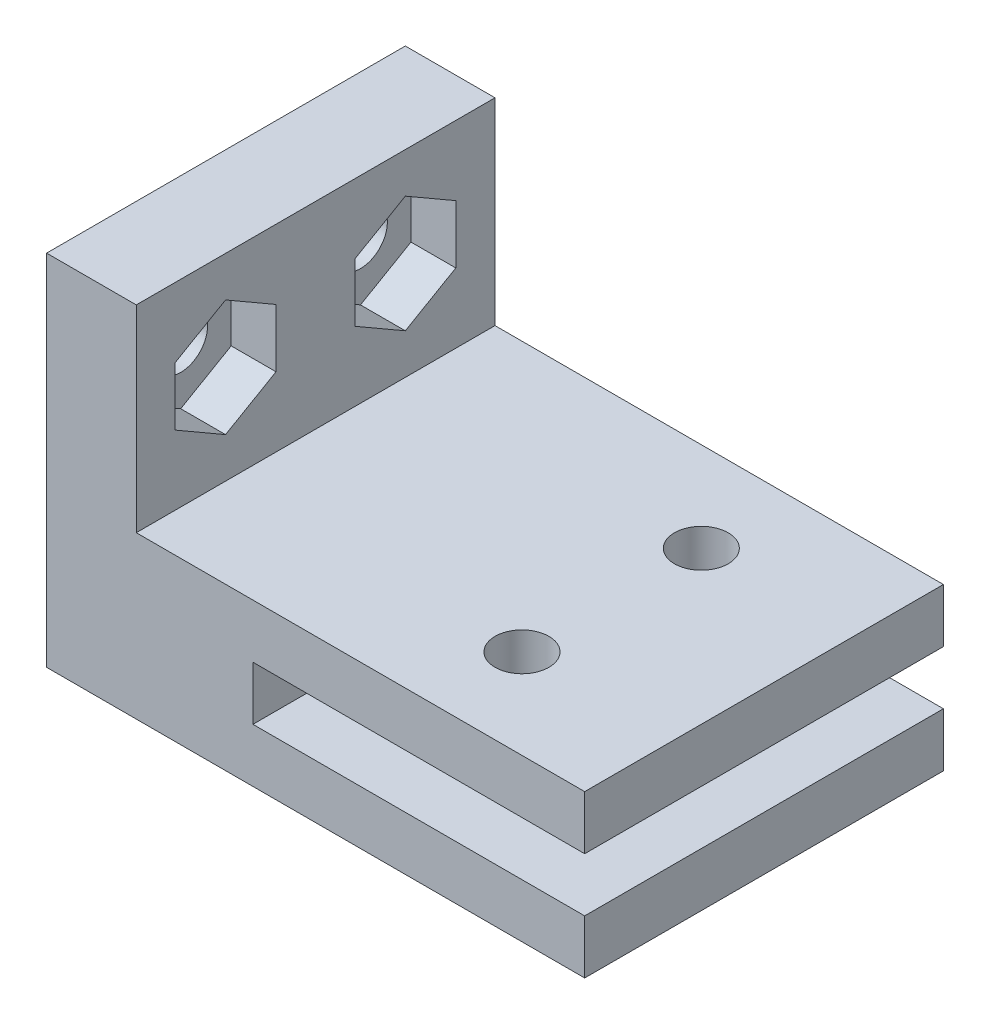
ISO-10303-21;
HEADER;
FILE_DESCRIPTION(('STEP AP214'),'2;1');
FILE_NAME('part.step','',(''),(''),'','','');
FILE_SCHEMA(('AUTOMOTIVE_DESIGN { 1 0 10303 214 1 1 1 1 }'));
ENDSEC;
DATA;
#1=APPLICATION_CONTEXT('core data for automotive mechanical design processes');
#2=APPLICATION_PROTOCOL_DEFINITION('international standard','automotive_design',2000,#1);
#3=PRODUCT_CONTEXT('',#1,'mechanical');
#4=PRODUCT('Part','Part','',(#3));
#5=PRODUCT_RELATED_PRODUCT_CATEGORY('part','',(#4));
#6=PRODUCT_DEFINITION_FORMATION('','',#4);
#7=PRODUCT_DEFINITION_CONTEXT('part definition',#1,'design');
#8=PRODUCT_DEFINITION('design','',#6,#7);
#9=PRODUCT_DEFINITION_SHAPE('','',#8);
#10=(LENGTH_UNIT() NAMED_UNIT(*) SI_UNIT(.MILLI.,.METRE.));
#11=(NAMED_UNIT(*) PLANE_ANGLE_UNIT() SI_UNIT($,.RADIAN.));
#12=(NAMED_UNIT(*) SI_UNIT($,.STERADIAN.) SOLID_ANGLE_UNIT());
#13=UNCERTAINTY_MEASURE_WITH_UNIT(LENGTH_MEASURE(1.E-05),#10,'distance_accuracy_value','');
#14=(GEOMETRIC_REPRESENTATION_CONTEXT(3) GLOBAL_UNCERTAINTY_ASSIGNED_CONTEXT((#13)) GLOBAL_UNIT_ASSIGNED_CONTEXT((#10,
#11,#12)) REPRESENTATION_CONTEXT('',''));
#15=CARTESIAN_POINT('',(0.,0.,0.));
#16=DIRECTION('',(0.,0.,1.));
#17=DIRECTION('',(1.,0.,0.));
#18=AXIS2_PLACEMENT_3D('',#15,#16,#17);
#19=CARTESIAN_POINT('',(-9.99999999999999,4.50000000000364,4.99999999999773));
#20=DIRECTION('',(1.,0.,0.));
#21=DIRECTION('',(0.,0.,-1.));
#22=AXIS2_PLACEMENT_3D('',#19,#20,#21);
#23=CYLINDRICAL_SURFACE('',#22,1.5);
#24=CARTESIAN_POINT('',(-9.99999999999999,4.50000000000364,4.99999999999773));
#25=DIRECTION('',(1.,0.,0.));
#26=DIRECTION('',(0.,0.,-1.));
#27=AXIS2_PLACEMENT_3D('',#24,#25,#26);
#28=CIRCLE('',#27,1.5);
#29=CARTESIAN_POINT('',(-9.99999999999999,4.50000000000364,3.49999999999773));
#30=VERTEX_POINT('',#29);
#31=EDGE_CURVE('E283',#30,#30,#28,.T.);
#32=ORIENTED_EDGE('',*,*,#31,.F.);
#33=EDGE_LOOP('',(#32));
#34=FACE_BOUND('',#33,.T.);
#35=CARTESIAN_POINT('',(-7.49999999999999,4.50000000000364,4.99999999999773));
#36=DIRECTION('',(1.,0.,0.));
#37=DIRECTION('',(0.,0.,-1.));
#38=AXIS2_PLACEMENT_3D('',#35,#36,#37);
#39=CIRCLE('',#38,1.5);
#40=CARTESIAN_POINT('',(-7.49999999999999,4.50000000000364,3.49999999999773));
#41=VERTEX_POINT('',#40);
#42=EDGE_CURVE('E205',#41,#41,#39,.F.);
#43=ORIENTED_EDGE('',*,*,#42,.F.);
#44=EDGE_LOOP('',(#43));
#45=FACE_BOUND('',#44,.T.);
#46=ADVANCED_FACE('F33',(#34,#45),#23,.F.);
#47=CARTESIAN_POINT('',(-9.99999999999999,4.5,15.0236496921252));
#48=DIRECTION('',(1.,0.,0.));
#49=DIRECTION('',(0.,0.,-1.));
#50=AXIS2_PLACEMENT_3D('',#47,#48,#49);
#51=CYLINDRICAL_SURFACE('',#50,1.5);
#52=CARTESIAN_POINT('',(-9.99999999999999,4.5,15.0236496921252));
#53=DIRECTION('',(1.,0.,0.));
#54=DIRECTION('',(0.,0.,-1.));
#55=AXIS2_PLACEMENT_3D('',#52,#53,#54);
#56=CIRCLE('',#55,1.5);
#57=CARTESIAN_POINT('',(-9.99999999999999,4.5,13.5236496921252));
#58=VERTEX_POINT('',#57);
#59=EDGE_CURVE('E295',#58,#58,#56,.T.);
#60=ORIENTED_EDGE('',*,*,#59,.F.);
#61=EDGE_LOOP('',(#60));
#62=FACE_BOUND('',#61,.T.);
#63=CARTESIAN_POINT('',(-7.49999999999999,4.5,15.0236496921252));
#64=DIRECTION('',(1.,0.,0.));
#65=DIRECTION('',(0.,0.,-1.));
#66=AXIS2_PLACEMENT_3D('',#63,#64,#65);
#67=CIRCLE('',#66,1.5);
#68=CARTESIAN_POINT('',(-7.49999999999999,4.5,13.5236496921252));
#69=VERTEX_POINT('',#68);
#70=EDGE_CURVE('E243',#69,#69,#67,.F.);
#71=ORIENTED_EDGE('',*,*,#70,.F.);
#72=EDGE_LOOP('',(#71));
#73=FACE_BOUND('',#72,.T.);
#74=ADVANCED_FACE('F459',(#62,#73),#51,.F.);
#75=CARTESIAN_POINT('',(0.,0.,20.));
#76=DIRECTION('',(0.,0.,1.));
#77=DIRECTION('',(1.,0.,0.));
#78=AXIS2_PLACEMENT_3D('',#75,#76,#77);
#79=PLANE('',#78);
#80=DIRECTION('',(0.,1.,0.));
#81=VECTOR('',#80,1.);
#82=CARTESIAN_POINT('',(1.50370918476346,0.,20.));
#83=LINE('',#82,#81);
#84=CARTESIAN_POINT('',(1.50370918476346,-7.,20.));
#85=VERTEX_POINT('',#84);
#86=CARTESIAN_POINT('',(1.50370918476346,-4.,20.));
#87=VERTEX_POINT('',#86);
#88=EDGE_CURVE('E309',#85,#87,#83,.T.);
#89=ORIENTED_EDGE('',*,*,#88,.T.);
#90=DIRECTION('',(1.,0.,0.));
#91=VECTOR('',#90,1.);
#92=CARTESIAN_POINT('',(0.,-4.,20.));
#93=LINE('',#92,#91);
#94=CARTESIAN_POINT('',(20.,-4.,20.));
#95=VERTEX_POINT('',#94);
#96=EDGE_CURVE('E298',#87,#95,#93,.T.);
#97=ORIENTED_EDGE('',*,*,#96,.T.);
#98=DIRECTION('',(0.,1.,0.));
#99=VECTOR('',#98,1.);
#100=CARTESIAN_POINT('',(20.,-10.,20.));
#101=LINE('',#100,#99);
#102=CARTESIAN_POINT('',(20.,-1.,20.));
#103=VERTEX_POINT('',#102);
#104=EDGE_CURVE('E352',#95,#103,#101,.T.);
#105=ORIENTED_EDGE('',*,*,#104,.T.);
#106=DIRECTION('',(-1.,0.,0.));
#107=VECTOR('',#106,1.);
#108=CARTESIAN_POINT('',(0.,-1.,20.));
#109=LINE('',#108,#107);
#110=CARTESIAN_POINT('',(-4.99999999999999,-1.,20.));
#111=VERTEX_POINT('',#110);
#112=EDGE_CURVE('E326',#103,#111,#109,.T.);
#113=ORIENTED_EDGE('',*,*,#112,.T.);
#114=DIRECTION('',(0.,1.,0.));
#115=VECTOR('',#114,1.);
#116=CARTESIAN_POINT('',(-4.99999999999999,0.,20.));
#117=LINE('',#116,#115);
#118=CARTESIAN_POINT('',(-4.99999999999999,10.,20.));
#119=VERTEX_POINT('',#118);
#120=EDGE_CURVE('E316',#111,#119,#117,.T.);
#121=ORIENTED_EDGE('',*,*,#120,.T.);
#122=DIRECTION('',(-1.,0.,0.));
#123=VECTOR('',#122,1.);
#124=CARTESIAN_POINT('',(20.,10.,20.));
#125=LINE('',#124,#123);
#126=CARTESIAN_POINT('',(-9.99999999999999,9.99999999999999,20.));
#127=VERTEX_POINT('',#126);
#128=EDGE_CURVE('E42',#119,#127,#125,.T.);
#129=ORIENTED_EDGE('',*,*,#128,.T.);
#130=DIRECTION('',(0.,1.,0.));
#131=VECTOR('',#130,1.);
#132=CARTESIAN_POINT('',(-9.99999999999999,-10.,20.));
#133=LINE('',#132,#131);
#134=CARTESIAN_POINT('',(-9.99999999999999,-10.,20.));
#135=VERTEX_POINT('',#134);
#136=EDGE_CURVE('E346',#135,#127,#133,.T.);
#137=ORIENTED_EDGE('',*,*,#136,.F.);
#138=DIRECTION('',(1.,0.,0.));
#139=VECTOR('',#138,1.);
#140=CARTESIAN_POINT('',(20.,-10.,20.));
#141=LINE('',#140,#139);
#142=CARTESIAN_POINT('',(20.,-10.,20.));
#143=VERTEX_POINT('',#142);
#144=EDGE_CURVE('E350',#135,#143,#141,.T.);
#145=ORIENTED_EDGE('',*,*,#144,.T.);
#146=CARTESIAN_POINT('',(20.,-7.,20.));
#147=VERTEX_POINT('',#146);
#148=EDGE_CURVE('E354',#143,#147,#101,.T.);
#149=ORIENTED_EDGE('',*,*,#148,.T.);
#150=DIRECTION('',(-1.,0.,0.));
#151=VECTOR('',#150,1.);
#152=CARTESIAN_POINT('',(0.,-7.,20.));
#153=LINE('',#152,#151);
#154=EDGE_CURVE('E302',#147,#85,#153,.T.);
#155=ORIENTED_EDGE('',*,*,#154,.T.);
#156=EDGE_LOOP('',(#89,#97,#105,#113,#121,#129,#137,#145,#149,#155));
#157=FACE_BOUND('',#156,.T.);
#158=ADVANCED_FACE('F408',(#157),#79,.T.);
#159=CARTESIAN_POINT('',(0.,0.,0.));
#160=DIRECTION('',(0.,0.,1.));
#161=DIRECTION('',(1.,0.,0.));
#162=AXIS2_PLACEMENT_3D('',#159,#160,#161);
#163=PLANE('',#162);
#164=DIRECTION('',(1.,0.,0.));
#165=VECTOR('',#164,1.);
#166=CARTESIAN_POINT('',(0.,-4.,0.));
#167=LINE('',#166,#165);
#168=CARTESIAN_POINT('',(1.50370918476346,-4.,0.));
#169=VERTEX_POINT('',#168);
#170=CARTESIAN_POINT('',(20.,-4.,0.));
#171=VERTEX_POINT('',#170);
#172=EDGE_CURVE('E299',#169,#171,#167,.T.);
#173=ORIENTED_EDGE('',*,*,#172,.F.);
#174=DIRECTION('',(0.,1.,0.));
#175=VECTOR('',#174,1.);
#176=CARTESIAN_POINT('',(1.50370918476346,0.,0.));
#177=LINE('',#176,#175);
#178=CARTESIAN_POINT('',(1.50370918476346,-7.,0.));
#179=VERTEX_POINT('',#178);
#180=EDGE_CURVE('E301',#179,#169,#177,.T.);
#181=ORIENTED_EDGE('',*,*,#180,.F.);
#182=DIRECTION('',(-1.,0.,0.));
#183=VECTOR('',#182,1.);
#184=CARTESIAN_POINT('',(0.,-7.,0.));
#185=LINE('',#184,#183);
#186=CARTESIAN_POINT('',(20.,-7.,0.));
#187=VERTEX_POINT('',#186);
#188=EDGE_CURVE('E304',#187,#179,#185,.T.);
#189=ORIENTED_EDGE('',*,*,#188,.F.);
#190=DIRECTION('',(0.,1.,0.));
#191=VECTOR('',#190,1.);
#192=CARTESIAN_POINT('',(20.,-10.,0.));
#193=LINE('',#192,#191);
#194=CARTESIAN_POINT('',(20.,-10.,0.));
#195=VERTEX_POINT('',#194);
#196=EDGE_CURVE('E360',#195,#187,#193,.T.);
#197=ORIENTED_EDGE('',*,*,#196,.F.);
#198=DIRECTION('',(1.,0.,0.));
#199=VECTOR('',#198,1.);
#200=CARTESIAN_POINT('',(20.,-10.,0.));
#201=LINE('',#200,#199);
#202=CARTESIAN_POINT('',(-9.99999999999999,-10.,0.));
#203=VERTEX_POINT('',#202);
#204=EDGE_CURVE('E349',#203,#195,#201,.T.);
#205=ORIENTED_EDGE('',*,*,#204,.F.);
#206=DIRECTION('',(0.,-1.,0.));
#207=VECTOR('',#206,1.);
#208=CARTESIAN_POINT('',(-9.99999999999999,9.99999999999999,0.));
#209=LINE('',#208,#207);
#210=CARTESIAN_POINT('',(-9.99999999999999,10.,0.));
#211=VERTEX_POINT('',#210);
#212=EDGE_CURVE('E342',#211,#203,#209,.T.);
#213=ORIENTED_EDGE('',*,*,#212,.F.);
#214=DIRECTION('',(-1.,0.,0.));
#215=VECTOR('',#214,1.);
#216=CARTESIAN_POINT('',(20.,10.,0.));
#217=LINE('',#216,#215);
#218=CARTESIAN_POINT('',(-4.99999999999999,10.,0.));
#219=VERTEX_POINT('',#218);
#220=EDGE_CURVE('E353',#219,#211,#217,.T.);
#221=ORIENTED_EDGE('',*,*,#220,.F.);
#222=DIRECTION('',(0.,1.,0.));
#223=VECTOR('',#222,1.);
#224=CARTESIAN_POINT('',(-4.99999999999999,0.,0.));
#225=LINE('',#224,#223);
#226=CARTESIAN_POINT('',(-4.99999999999999,-1.,0.));
#227=VERTEX_POINT('',#226);
#228=EDGE_CURVE('E323',#227,#219,#225,.T.);
#229=ORIENTED_EDGE('',*,*,#228,.F.);
#230=DIRECTION('',(-1.,0.,0.));
#231=VECTOR('',#230,1.);
#232=CARTESIAN_POINT('',(0.,-1.,0.));
#233=LINE('',#232,#231);
#234=CARTESIAN_POINT('',(20.,-1.,0.));
#235=VERTEX_POINT('',#234);
#236=EDGE_CURVE('E325',#235,#227,#233,.T.);
#237=ORIENTED_EDGE('',*,*,#236,.F.);
#238=EDGE_CURVE('E359',#171,#235,#193,.T.);
#239=ORIENTED_EDGE('',*,*,#238,.F.);
#240=EDGE_LOOP('',(#173,#181,#189,#197,#205,#213,#221,#229,#237,#239));
#241=FACE_BOUND('',#240,.T.);
#242=ADVANCED_FACE('F417',(#241),#163,.F.);
#243=CARTESIAN_POINT('',(20.,-10.,20.));
#244=DIRECTION('',(-1.,0.,0.));
#245=DIRECTION('',(0.,0.,1.));
#246=AXIS2_PLACEMENT_3D('',#243,#244,#245);
#247=PLANE('',#246);
#248=DIRECTION('',(0.,0.,1.));
#249=VECTOR('',#248,1.);
#250=CARTESIAN_POINT('',(20.,-4.,0.));
#251=LINE('',#250,#249);
#252=EDGE_CURVE('E314',#171,#95,#251,.T.);
#253=ORIENTED_EDGE('',*,*,#252,.F.);
#254=ORIENTED_EDGE('',*,*,#238,.T.);
#255=DIRECTION('',(0.,0.,1.));
#256=VECTOR('',#255,1.);
#257=CARTESIAN_POINT('',(20.,-1.,0.));
#258=LINE('',#257,#256);
#259=EDGE_CURVE('E336',#235,#103,#258,.T.);
#260=ORIENTED_EDGE('',*,*,#259,.T.);
#261=ORIENTED_EDGE('',*,*,#104,.F.);
#262=EDGE_LOOP('',(#253,#254,#260,#261));
#263=FACE_BOUND('',#262,.T.);
#264=ADVANCED_FACE('F428',(#263),#247,.F.);
#265=DIRECTION('',(0.,0.,1.));
#266=VECTOR('',#265,1.);
#267=CARTESIAN_POINT('',(20.,-7.,0.));
#268=LINE('',#267,#266);
#269=EDGE_CURVE('E317',#187,#147,#268,.T.);
#270=ORIENTED_EDGE('',*,*,#269,.T.);
#271=ORIENTED_EDGE('',*,*,#148,.F.);
#272=DIRECTION('',(0.,0.,-1.));
#273=VECTOR('',#272,1.);
#274=CARTESIAN_POINT('',(20.,-10.,20.));
#275=LINE('',#274,#273);
#276=EDGE_CURVE('E11',#143,#195,#275,.T.);
#277=ORIENTED_EDGE('',*,*,#276,.T.);
#278=ORIENTED_EDGE('',*,*,#196,.T.);
#279=EDGE_LOOP('',(#270,#271,#277,#278));
#280=FACE_BOUND('',#279,.T.);
#281=ADVANCED_FACE('F406',(#280),#247,.F.);
#282=CARTESIAN_POINT('',(20.,10.,20.));
#283=DIRECTION('',(0.,-1.,0.));
#284=DIRECTION('',(1.,0.,0.));
#285=AXIS2_PLACEMENT_3D('',#282,#283,#284);
#286=PLANE('',#285);
#287=DIRECTION('',(0.,0.,1.));
#288=VECTOR('',#287,1.);
#289=CARTESIAN_POINT('',(-4.99999999999999,10.,0.));
#290=LINE('',#289,#288);
#291=EDGE_CURVE('E333',#219,#119,#290,.T.);
#292=ORIENTED_EDGE('',*,*,#291,.F.);
#293=ORIENTED_EDGE('',*,*,#220,.T.);
#294=DIRECTION('',(0.,0.,-1.));
#295=VECTOR('',#294,1.);
#296=CARTESIAN_POINT('',(-9.99999999999999,9.99999999999999,20.));
#297=LINE('',#296,#295);
#298=EDGE_CURVE('E335',#127,#211,#297,.T.);
#299=ORIENTED_EDGE('',*,*,#298,.F.);
#300=ORIENTED_EDGE('',*,*,#128,.F.);
#301=EDGE_LOOP('',(#292,#293,#299,#300));
#302=FACE_BOUND('',#301,.T.);
#303=ADVANCED_FACE('F443',(#302),#286,.F.);
#304=CARTESIAN_POINT('',(20.,-10.,20.));
#305=DIRECTION('',(0.,1.,0.));
#306=DIRECTION('',(-1.,0.,0.));
#307=AXIS2_PLACEMENT_3D('',#304,#305,#306);
#308=PLANE('',#307);
#309=CARTESIAN_POINT('',(11.5037091847635,-10.,15.));
#310=DIRECTION('',(0.,1.,0.));
#311=DIRECTION('',(-1.,0.,0.));
#312=AXIS2_PLACEMENT_3D('',#309,#310,#311);
#313=CIRCLE('',#312,1.5);
#314=CARTESIAN_POINT('',(10.0037091847635,-10.,15.));
#315=VERTEX_POINT('',#314);
#316=EDGE_CURVE('E383',#315,#315,#313,.T.);
#317=ORIENTED_EDGE('',*,*,#316,.T.);
#318=EDGE_LOOP('',(#317));
#319=FACE_BOUND('',#318,.T.);
#320=CARTESIAN_POINT('',(11.5037091847635,-10.,5.));
#321=DIRECTION('',(0.,1.,0.));
#322=DIRECTION('',(-1.,0.,0.));
#323=AXIS2_PLACEMENT_3D('',#320,#321,#322);
#324=CIRCLE('',#323,1.5);
#325=CARTESIAN_POINT('',(10.0037091847635,-10.,5.));
#326=VERTEX_POINT('',#325);
#327=EDGE_CURVE('E365',#326,#326,#324,.T.);
#328=ORIENTED_EDGE('',*,*,#327,.T.);
#329=EDGE_LOOP('',(#328));
#330=FACE_BOUND('',#329,.T.);
#331=DIRECTION('',(0.,0.,1.));
#332=VECTOR('',#331,1.);
#333=CARTESIAN_POINT('',(-9.99999999999999,-10.,0.));
#334=LINE('',#333,#332);
#335=EDGE_CURVE('E344',#203,#135,#334,.T.);
#336=ORIENTED_EDGE('',*,*,#335,.F.);
#337=ORIENTED_EDGE('',*,*,#204,.T.);
#338=ORIENTED_EDGE('',*,*,#276,.F.);
#339=ORIENTED_EDGE('',*,*,#144,.F.);
#340=EDGE_LOOP('',(#336,#337,#338,#339));
#341=FACE_BOUND('',#340,.T.);
#342=ADVANCED_FACE('F35',(#319,#330,#341),#308,.F.);
#343=CARTESIAN_POINT('',(-9.99999999999999,0.,0.));
#344=DIRECTION('',(-1.,0.,0.));
#345=DIRECTION('',(0.,0.,1.));
#346=AXIS2_PLACEMENT_3D('',#343,#344,#345);
#347=PLANE('',#346);
#348=ORIENTED_EDGE('',*,*,#31,.T.);
#349=EDGE_LOOP('',(#348));
#350=FACE_BOUND('',#349,.T.);
#351=ORIENTED_EDGE('',*,*,#59,.T.);
#352=EDGE_LOOP('',(#351));
#353=FACE_BOUND('',#352,.T.);
#354=ORIENTED_EDGE('',*,*,#298,.T.);
#355=ORIENTED_EDGE('',*,*,#212,.T.);
#356=ORIENTED_EDGE('',*,*,#335,.T.);
#357=ORIENTED_EDGE('',*,*,#136,.T.);
#358=EDGE_LOOP('',(#354,#355,#356,#357));
#359=FACE_BOUND('',#358,.T.);
#360=ADVANCED_FACE('F446',(#350,#353,#359),#347,.T.);
#361=CARTESIAN_POINT('',(-4.99999999999999,0.,0.));
#362=DIRECTION('',(1.,0.,0.));
#363=DIRECTION('',(0.,0.,-1.));
#364=AXIS2_PLACEMENT_3D('',#361,#362,#363);
#365=PLANE('',#364);
#366=DIRECTION('',(0.,1.,0.));
#367=VECTOR('',#366,1.);
#368=CARTESIAN_POINT('',(-4.99999999999999,0.,2.18499999999773));
#369=LINE('',#368,#367);
#370=CARTESIAN_POINT('',(-4.99999999999999,2.87475899223484,2.18499999999773));
#371=VERTEX_POINT('',#370);
#372=CARTESIAN_POINT('',(-4.99999999999999,6.12524100777244,2.18499999999773));
#373=VERTEX_POINT('',#372);
#374=EDGE_CURVE('E50',#371,#373,#369,.T.);
#375=ORIENTED_EDGE('',*,*,#374,.F.);
#376=DIRECTION('',(0.,0.5,-0.866025403784438));
#377=VECTOR('',#376,1.);
#378=CARTESIAN_POINT('',(-4.99999999999999,3.10220199780965,1.791057158516));
#379=LINE('',#378,#377);
#380=CARTESIAN_POINT('',(-4.99999999999999,1.24951798446604,4.99999999999773));
#381=VERTEX_POINT('',#380);
#382=EDGE_CURVE('E208',#381,#371,#379,.T.);
#383=ORIENTED_EDGE('',*,*,#382,.F.);
#384=DIRECTION('',(0.,-0.5,-0.866025403784439));
#385=VECTOR('',#384,1.);
#386=CARTESIAN_POINT('',(-4.99999999999999,-1.22792502111058,0.70894284148287));
#387=LINE('',#386,#385);
#388=CARTESIAN_POINT('',(-4.99999999999999,2.87475899223484,7.81499999999773));
#389=VERTEX_POINT('',#388);
#390=EDGE_CURVE('E229',#389,#381,#387,.T.);
#391=ORIENTED_EDGE('',*,*,#390,.F.);
#392=DIRECTION('',(0.,-1.,0.));
#393=VECTOR('',#392,1.);
#394=CARTESIAN_POINT('',(-4.99999999999999,0.,7.81499999999773));
#395=LINE('',#394,#393);
#396=CARTESIAN_POINT('',(-4.99999999999999,6.12524100777243,7.81499999999773));
#397=VERTEX_POINT('',#396);
#398=EDGE_CURVE('E226',#397,#389,#395,.T.);
#399=ORIENTED_EDGE('',*,*,#398,.F.);
#400=DIRECTION('',(0.,-0.5,0.866025403784439));
#401=VECTOR('',#400,1.);
#402=CARTESIAN_POINT('',(-4.99999999999999,7.97792502111603,4.606057158516));
#403=LINE('',#402,#401);
#404=CARTESIAN_POINT('',(-4.99999999999999,7.75048201554123,4.99999999999773));
#405=VERTEX_POINT('',#404);
#406=EDGE_CURVE('E223',#405,#397,#403,.T.);
#407=ORIENTED_EDGE('',*,*,#406,.F.);
#408=DIRECTION('',(0.,0.5,0.866025403784439));
#409=VECTOR('',#408,1.);
#410=CARTESIAN_POINT('',(-4.99999999999999,3.64779800219581,-2.10605715851713));
#411=LINE('',#410,#409);
#412=EDGE_CURVE('E220',#373,#405,#411,.T.);
#413=ORIENTED_EDGE('',*,*,#412,.F.);
#414=EDGE_LOOP('',(#375,#383,#391,#399,#407,#413));
#415=FACE_BOUND('',#414,.T.);
#416=DIRECTION('',(0.,1.,0.));
#417=VECTOR('',#416,1.);
#418=CARTESIAN_POINT('',(-4.99999999999999,0.,12.2086496921252));
#419=LINE('',#418,#417);
#420=CARTESIAN_POINT('',(-4.99999999999999,2.8747589922312,12.2086496921252));
#421=VERTEX_POINT('',#420);
#422=CARTESIAN_POINT('',(-4.99999999999999,6.1252410077688,12.2086496921252));
#423=VERTEX_POINT('',#422);
#424=EDGE_CURVE('E58',#421,#423,#419,.T.);
#425=ORIENTED_EDGE('',*,*,#424,.F.);
#426=DIRECTION('',(0.,0.5,-0.866025403784439));
#427=VECTOR('',#426,1.);
#428=CARTESIAN_POINT('',(-4.99999999999999,7.44256963381615,4.29696958154629));
#429=LINE('',#428,#427);
#430=CARTESIAN_POINT('',(-4.99999999999999,1.2495179844624,15.0236496921252));
#431=VERTEX_POINT('',#430);
#432=EDGE_CURVE('E247',#431,#421,#429,.T.);
#433=ORIENTED_EDGE('',*,*,#432,.F.);
#434=DIRECTION('',(0.,-0.5,-0.866025403784439));
#435=VECTOR('',#434,1.);
#436=CARTESIAN_POINT('',(-4.99999999999999,-5.56829265712255,3.21485526451632));
#437=LINE('',#436,#435);
#438=CARTESIAN_POINT('',(-4.99999999999999,2.8747589922312,17.8386496921252));
#439=VERTEX_POINT('',#438);
#440=EDGE_CURVE('E276',#439,#431,#437,.T.);
#441=ORIENTED_EDGE('',*,*,#440,.F.);
#442=DIRECTION('',(0.,-1.,0.));
#443=VECTOR('',#442,1.);
#444=CARTESIAN_POINT('',(-4.99999999999999,0.,17.8386496921252));
#445=LINE('',#444,#443);
#446=CARTESIAN_POINT('',(-4.99999999999999,6.12524100776879,17.8386496921252));
#447=VERTEX_POINT('',#446);
#448=EDGE_CURVE('E273',#447,#439,#445,.T.);
#449=ORIENTED_EDGE('',*,*,#448,.F.);
#450=DIRECTION('',(0.,-0.5,0.866025403784438));
#451=VECTOR('',#450,1.);
#452=CARTESIAN_POINT('',(-4.99999999999999,12.3182926571225,7.1119695815463));
#453=LINE('',#452,#451);
#454=CARTESIAN_POINT('',(-4.99999999999999,7.7504820155376,15.0236496921252));
#455=VERTEX_POINT('',#454);
#456=EDGE_CURVE('E270',#455,#447,#453,.T.);
#457=ORIENTED_EDGE('',*,*,#456,.F.);
#458=DIRECTION('',(0.,0.5,0.866025403784439));
#459=VECTOR('',#458,1.);
#460=CARTESIAN_POINT('',(-4.99999999999999,-0.692569633816156,0.399855264516318));
#461=LINE('',#460,#459);
#462=EDGE_CURVE('E267',#423,#455,#461,.T.);
#463=ORIENTED_EDGE('',*,*,#462,.F.);
#464=EDGE_LOOP('',(#425,#433,#441,#449,#457,#463));
#465=FACE_BOUND('',#464,.T.);
#466=ORIENTED_EDGE('',*,*,#120,.F.);
#467=DIRECTION('',(0.,0.,1.));
#468=VECTOR('',#467,1.);
#469=CARTESIAN_POINT('',(-4.99999999999999,-1.,0.));
#470=LINE('',#469,#468);
#471=EDGE_CURVE('E328',#227,#111,#470,.T.);
#472=ORIENTED_EDGE('',*,*,#471,.F.);
#473=ORIENTED_EDGE('',*,*,#228,.T.);
#474=ORIENTED_EDGE('',*,*,#291,.T.);
#475=EDGE_LOOP('',(#466,#472,#473,#474));
#476=FACE_BOUND('',#475,.T.);
#477=ADVANCED_FACE('F440',(#415,#465,#476),#365,.T.);
#478=CARTESIAN_POINT('',(0.,-1.,0.));
#479=DIRECTION('',(0.,1.,0.));
#480=DIRECTION('',(-1.,0.,0.));
#481=AXIS2_PLACEMENT_3D('',#478,#479,#480);
#482=PLANE('',#481);
#483=CARTESIAN_POINT('',(11.5037091847635,-1.,15.));
#484=DIRECTION('',(0.,1.,0.));
#485=DIRECTION('',(-1.,0.,0.));
#486=AXIS2_PLACEMENT_3D('',#483,#484,#485);
#487=CIRCLE('',#486,1.5);
#488=CARTESIAN_POINT('',(10.0037091847635,-1.,15.));
#489=VERTEX_POINT('',#488);
#490=EDGE_CURVE('E380',#489,#489,#487,.T.);
#491=ORIENTED_EDGE('',*,*,#490,.F.);
#492=EDGE_LOOP('',(#491));
#493=FACE_BOUND('',#492,.T.);
#494=CARTESIAN_POINT('',(11.5037091847635,-1.,5.));
#495=DIRECTION('',(0.,1.,0.));
#496=DIRECTION('',(-1.,0.,0.));
#497=AXIS2_PLACEMENT_3D('',#494,#495,#496);
#498=CIRCLE('',#497,1.5);
#499=CARTESIAN_POINT('',(10.0037091847635,-1.,5.));
#500=VERTEX_POINT('',#499);
#501=EDGE_CURVE('E370',#500,#500,#498,.T.);
#502=ORIENTED_EDGE('',*,*,#501,.F.);
#503=EDGE_LOOP('',(#502));
#504=FACE_BOUND('',#503,.T.);
#505=ORIENTED_EDGE('',*,*,#112,.F.);
#506=ORIENTED_EDGE('',*,*,#259,.F.);
#507=ORIENTED_EDGE('',*,*,#236,.T.);
#508=ORIENTED_EDGE('',*,*,#471,.T.);
#509=EDGE_LOOP('',(#505,#506,#507,#508));
#510=FACE_BOUND('',#509,.T.);
#511=ADVANCED_FACE('F433',(#493,#504,#510),#482,.T.);
#512=CARTESIAN_POINT('',(0.,-4.,0.));
#513=DIRECTION('',(0.,-1.,0.));
#514=DIRECTION('',(0.,0.,-1.));
#515=AXIS2_PLACEMENT_3D('',#512,#513,#514);
#516=PLANE('',#515);
#517=CARTESIAN_POINT('',(11.5037091847635,-4.,15.));
#518=DIRECTION('',(0.,-1.,0.));
#519=DIRECTION('',(0.,0.,-1.));
#520=AXIS2_PLACEMENT_3D('',#517,#518,#519);
#521=CIRCLE('',#520,1.5);
#522=CARTESIAN_POINT('',(11.5037091847635,-4.,13.5));
#523=VERTEX_POINT('',#522);
#524=EDGE_CURVE('E375',#523,#523,#521,.T.);
#525=ORIENTED_EDGE('',*,*,#524,.F.);
#526=EDGE_LOOP('',(#525));
#527=FACE_BOUND('',#526,.T.);
#528=CARTESIAN_POINT('',(11.5037091847635,-4.,5.));
#529=DIRECTION('',(0.,-1.,0.));
#530=DIRECTION('',(0.,0.,-1.));
#531=AXIS2_PLACEMENT_3D('',#528,#529,#530);
#532=CIRCLE('',#531,1.5);
#533=CARTESIAN_POINT('',(11.5037091847635,-4.,3.5));
#534=VERTEX_POINT('',#533);
#535=EDGE_CURVE('E221',#534,#534,#532,.T.);
#536=ORIENTED_EDGE('',*,*,#535,.F.);
#537=EDGE_LOOP('',(#536));
#538=FACE_BOUND('',#537,.T.);
#539=ORIENTED_EDGE('',*,*,#96,.F.);
#540=DIRECTION('',(0.,0.,1.));
#541=VECTOR('',#540,1.);
#542=CARTESIAN_POINT('',(1.50370918476346,-4.,0.));
#543=LINE('',#542,#541);
#544=EDGE_CURVE('E306',#169,#87,#543,.T.);
#545=ORIENTED_EDGE('',*,*,#544,.F.);
#546=ORIENTED_EDGE('',*,*,#172,.T.);
#547=ORIENTED_EDGE('',*,*,#252,.T.);
#548=EDGE_LOOP('',(#539,#545,#546,#547));
#549=FACE_BOUND('',#548,.T.);
#550=ADVANCED_FACE('F397',(#527,#538,#549),#516,.T.);
#551=CARTESIAN_POINT('',(0.,-7.,0.));
#552=DIRECTION('',(0.,1.,0.));
#553=DIRECTION('',(-1.,0.,0.));
#554=AXIS2_PLACEMENT_3D('',#551,#552,#553);
#555=PLANE('',#554);
#556=CARTESIAN_POINT('',(11.5037091847635,-7.,15.));
#557=DIRECTION('',(0.,1.,0.));
#558=DIRECTION('',(-1.,0.,0.));
#559=AXIS2_PLACEMENT_3D('',#556,#557,#558);
#560=CIRCLE('',#559,1.5);
#561=CARTESIAN_POINT('',(10.0037091847635,-7.,15.));
#562=VERTEX_POINT('',#561);
#563=EDGE_CURVE('E37',#562,#562,#560,.T.);
#564=ORIENTED_EDGE('',*,*,#563,.F.);
#565=EDGE_LOOP('',(#564));
#566=FACE_BOUND('',#565,.T.);
#567=CARTESIAN_POINT('',(11.5037091847635,-7.,5.));
#568=DIRECTION('',(0.,1.,0.));
#569=DIRECTION('',(-1.,0.,0.));
#570=AXIS2_PLACEMENT_3D('',#567,#568,#569);
#571=CIRCLE('',#570,1.5);
#572=CARTESIAN_POINT('',(10.0037091847635,-7.,5.));
#573=VERTEX_POINT('',#572);
#574=EDGE_CURVE('E363',#573,#573,#571,.T.);
#575=ORIENTED_EDGE('',*,*,#574,.F.);
#576=EDGE_LOOP('',(#575));
#577=FACE_BOUND('',#576,.T.);
#578=ORIENTED_EDGE('',*,*,#154,.F.);
#579=ORIENTED_EDGE('',*,*,#269,.F.);
#580=ORIENTED_EDGE('',*,*,#188,.T.);
#581=DIRECTION('',(0.,0.,1.));
#582=VECTOR('',#581,1.);
#583=CARTESIAN_POINT('',(1.50370918476346,-7.,0.));
#584=LINE('',#583,#582);
#585=EDGE_CURVE('E320',#179,#85,#584,.T.);
#586=ORIENTED_EDGE('',*,*,#585,.T.);
#587=EDGE_LOOP('',(#578,#579,#580,#586));
#588=FACE_BOUND('',#587,.T.);
#589=ADVANCED_FACE('F393',(#566,#577,#588),#555,.T.);
#590=CARTESIAN_POINT('',(1.50370918476346,0.,0.));
#591=DIRECTION('',(1.,0.,0.));
#592=DIRECTION('',(0.,1.,0.));
#593=AXIS2_PLACEMENT_3D('',#590,#591,#592);
#594=PLANE('',#593);
#595=ORIENTED_EDGE('',*,*,#88,.F.);
#596=ORIENTED_EDGE('',*,*,#585,.F.);
#597=ORIENTED_EDGE('',*,*,#180,.T.);
#598=ORIENTED_EDGE('',*,*,#544,.T.);
#599=EDGE_LOOP('',(#595,#596,#597,#598));
#600=FACE_BOUND('',#599,.T.);
#601=ADVANCED_FACE('F396',(#600),#594,.T.);
#602=CARTESIAN_POINT('',(-7.49999999999999,0.,12.2086496921252));
#603=DIRECTION('',(0.,0.,-1.));
#604=DIRECTION('',(-1.,0.,0.));
#605=AXIS2_PLACEMENT_3D('',#602,#603,#604);
#606=PLANE('',#605);
#607=ORIENTED_EDGE('',*,*,#424,.T.);
#608=DIRECTION('',(1.,0.,0.));
#609=VECTOR('',#608,1.);
#610=CARTESIAN_POINT('',(-7.49999999999999,6.1252410077688,12.2086496921252));
#611=LINE('',#610,#609);
#612=CARTESIAN_POINT('',(-7.49999999999999,6.1252410077688,12.2086496921252));
#613=VERTEX_POINT('',#612);
#614=EDGE_CURVE('E265',#613,#423,#611,.T.);
#615=ORIENTED_EDGE('',*,*,#614,.F.);
#616=DIRECTION('',(0.,1.,0.));
#617=VECTOR('',#616,1.);
#618=CARTESIAN_POINT('',(-7.49999999999999,0.,12.2086496921252));
#619=LINE('',#618,#617);
#620=CARTESIAN_POINT('',(-7.49999999999999,2.8747589922312,12.2086496921252));
#621=VERTEX_POINT('',#620);
#622=EDGE_CURVE('E246',#621,#613,#619,.T.);
#623=ORIENTED_EDGE('',*,*,#622,.F.);
#624=DIRECTION('',(1.,0.,0.));
#625=VECTOR('',#624,1.);
#626=CARTESIAN_POINT('',(-7.49999999999999,2.8747589922312,12.2086496921252));
#627=LINE('',#626,#625);
#628=EDGE_CURVE('E281',#621,#421,#627,.T.);
#629=ORIENTED_EDGE('',*,*,#628,.T.);
#630=EDGE_LOOP('',(#607,#615,#623,#629));
#631=FACE_BOUND('',#630,.T.);
#632=ADVANCED_FACE('F470',(#631),#606,.F.);
#633=CARTESIAN_POINT('',(-7.49999999999999,7.44256963381615,4.29696958154629));
#634=DIRECTION('',(0.,-0.866025403784438,-0.5));
#635=DIRECTION('',(0.,0.5,-0.866025403784439));
#636=AXIS2_PLACEMENT_3D('',#633,#634,#635);
#637=PLANE('',#636);
#638=ORIENTED_EDGE('',*,*,#432,.T.);
#639=ORIENTED_EDGE('',*,*,#628,.F.);
#640=DIRECTION('',(0.,0.5,-0.866025403784439));
#641=VECTOR('',#640,1.);
#642=CARTESIAN_POINT('',(-7.49999999999999,7.44256963381615,4.29696958154629));
#643=LINE('',#642,#641);
#644=CARTESIAN_POINT('',(-7.49999999999999,1.2495179844624,15.0236496921252));
#645=VERTEX_POINT('',#644);
#646=EDGE_CURVE('E262',#645,#621,#643,.T.);
#647=ORIENTED_EDGE('',*,*,#646,.F.);
#648=DIRECTION('',(1.,0.,0.));
#649=VECTOR('',#648,1.);
#650=CARTESIAN_POINT('',(-7.49999999999999,1.2495179844624,15.0236496921252));
#651=LINE('',#650,#649);
#652=EDGE_CURVE('E284',#645,#431,#651,.T.);
#653=ORIENTED_EDGE('',*,*,#652,.T.);
#654=EDGE_LOOP('',(#638,#639,#647,#653));
#655=FACE_BOUND('',#654,.T.);
#656=ADVANCED_FACE('F526',(#655),#637,.F.);
#657=CARTESIAN_POINT('',(-7.49999999999999,-5.56829265712255,3.21485526451632));
#658=DIRECTION('',(0.,-0.866025403784439,0.5));
#659=DIRECTION('',(0.,-0.5,-0.866025403784439));
#660=AXIS2_PLACEMENT_3D('',#657,#658,#659);
#661=PLANE('',#660);
#662=ORIENTED_EDGE('',*,*,#440,.T.);
#663=ORIENTED_EDGE('',*,*,#652,.F.);
#664=DIRECTION('',(0.,-0.5,-0.866025403784439));
#665=VECTOR('',#664,1.);
#666=CARTESIAN_POINT('',(-7.49999999999999,-5.56829265712255,3.21485526451632));
#667=LINE('',#666,#665);
#668=CARTESIAN_POINT('',(-7.49999999999999,2.8747589922312,17.8386496921252));
#669=VERTEX_POINT('',#668);
#670=EDGE_CURVE('E259',#669,#645,#667,.T.);
#671=ORIENTED_EDGE('',*,*,#670,.F.);
#672=DIRECTION('',(1.,0.,0.));
#673=VECTOR('',#672,1.);
#674=CARTESIAN_POINT('',(-7.49999999999999,2.8747589922312,17.8386496921252));
#675=LINE('',#674,#673);
#676=EDGE_CURVE('E286',#669,#439,#675,.T.);
#677=ORIENTED_EDGE('',*,*,#676,.T.);
#678=EDGE_LOOP('',(#662,#663,#671,#677));
#679=FACE_BOUND('',#678,.T.);
#680=ADVANCED_FACE('F529',(#679),#661,.F.);
#681=CARTESIAN_POINT('',(-7.49999999999999,0.,17.8386496921252));
#682=DIRECTION('',(0.,0.,1.));
#683=DIRECTION('',(1.,0.,0.));
#684=AXIS2_PLACEMENT_3D('',#681,#682,#683);
#685=PLANE('',#684);
#686=ORIENTED_EDGE('',*,*,#448,.T.);
#687=ORIENTED_EDGE('',*,*,#676,.F.);
#688=DIRECTION('',(0.,-1.,0.));
#689=VECTOR('',#688,1.);
#690=CARTESIAN_POINT('',(-7.49999999999999,0.,17.8386496921252));
#691=LINE('',#690,#689);
#692=CARTESIAN_POINT('',(-7.49999999999999,6.12524100776879,17.8386496921252));
#693=VERTEX_POINT('',#692);
#694=EDGE_CURVE('E256',#693,#669,#691,.T.);
#695=ORIENTED_EDGE('',*,*,#694,.F.);
#696=DIRECTION('',(1.,0.,0.));
#697=VECTOR('',#696,1.);
#698=CARTESIAN_POINT('',(-7.49999999999999,6.12524100776879,17.8386496921252));
#699=LINE('',#698,#697);
#700=EDGE_CURVE('E288',#693,#447,#699,.T.);
#701=ORIENTED_EDGE('',*,*,#700,.T.);
#702=EDGE_LOOP('',(#686,#687,#695,#701));
#703=FACE_BOUND('',#702,.T.);
#704=ADVANCED_FACE('F533',(#703),#685,.F.);
#705=CARTESIAN_POINT('',(-7.49999999999999,12.3182926571225,7.1119695815463));
#706=DIRECTION('',(0.,0.866025403784438,0.5));
#707=DIRECTION('',(0.,-0.5,0.866025403784438));
#708=AXIS2_PLACEMENT_3D('',#705,#706,#707);
#709=PLANE('',#708);
#710=ORIENTED_EDGE('',*,*,#456,.T.);
#711=ORIENTED_EDGE('',*,*,#700,.F.);
#712=DIRECTION('',(0.,-0.5,0.866025403784438));
#713=VECTOR('',#712,1.);
#714=CARTESIAN_POINT('',(-7.49999999999999,12.3182926571225,7.1119695815463));
#715=LINE('',#714,#713);
#716=CARTESIAN_POINT('',(-7.49999999999999,7.7504820155376,15.0236496921252));
#717=VERTEX_POINT('',#716);
#718=EDGE_CURVE('E253',#717,#693,#715,.T.);
#719=ORIENTED_EDGE('',*,*,#718,.F.);
#720=DIRECTION('',(1.,0.,0.));
#721=VECTOR('',#720,1.);
#722=CARTESIAN_POINT('',(-7.49999999999999,7.7504820155376,15.0236496921252));
#723=LINE('',#722,#721);
#724=EDGE_CURVE('E290',#717,#455,#723,.T.);
#725=ORIENTED_EDGE('',*,*,#724,.T.);
#726=EDGE_LOOP('',(#710,#711,#719,#725));
#727=FACE_BOUND('',#726,.T.);
#728=ADVANCED_FACE('F537',(#727),#709,.F.);
#729=CARTESIAN_POINT('',(-7.49999999999999,-0.692569633816156,0.399855264516318));
#730=DIRECTION('',(0.,0.866025403784439,-0.5));
#731=DIRECTION('',(0.,0.5,0.866025403784439));
#732=AXIS2_PLACEMENT_3D('',#729,#730,#731);
#733=PLANE('',#732);
#734=ORIENTED_EDGE('',*,*,#462,.T.);
#735=ORIENTED_EDGE('',*,*,#724,.F.);
#736=DIRECTION('',(0.,0.5,0.866025403784439));
#737=VECTOR('',#736,1.);
#738=CARTESIAN_POINT('',(-7.49999999999999,-0.692569633816156,0.399855264516318));
#739=LINE('',#738,#737);
#740=EDGE_CURVE('E250',#613,#717,#739,.T.);
#741=ORIENTED_EDGE('',*,*,#740,.F.);
#742=ORIENTED_EDGE('',*,*,#614,.T.);
#743=EDGE_LOOP('',(#734,#735,#741,#742));
#744=FACE_BOUND('',#743,.T.);
#745=ADVANCED_FACE('F524',(#744),#733,.F.);
#746=CARTESIAN_POINT('',(-7.49999999999999,0.,0.));
#747=DIRECTION('',(1.,0.,0.));
#748=DIRECTION('',(0.,0.,-1.));
#749=AXIS2_PLACEMENT_3D('',#746,#747,#748);
#750=PLANE('',#749);
#751=ORIENTED_EDGE('',*,*,#70,.T.);
#752=EDGE_LOOP('',(#751));
#753=FACE_BOUND('',#752,.T.);
#754=ORIENTED_EDGE('',*,*,#622,.T.);
#755=ORIENTED_EDGE('',*,*,#740,.T.);
#756=ORIENTED_EDGE('',*,*,#718,.T.);
#757=ORIENTED_EDGE('',*,*,#694,.T.);
#758=ORIENTED_EDGE('',*,*,#670,.T.);
#759=ORIENTED_EDGE('',*,*,#646,.T.);
#760=EDGE_LOOP('',(#754,#755,#756,#757,#758,#759));
#761=FACE_BOUND('',#760,.T.);
#762=ADVANCED_FACE('F521',(#753,#761),#750,.T.);
#763=CARTESIAN_POINT('',(-7.49999999999999,0.,2.18499999999773));
#764=DIRECTION('',(0.,0.,-1.));
#765=DIRECTION('',(-1.,0.,0.));
#766=AXIS2_PLACEMENT_3D('',#763,#764,#765);
#767=PLANE('',#766);
#768=ORIENTED_EDGE('',*,*,#374,.T.);
#769=DIRECTION('',(1.,0.,0.));
#770=VECTOR('',#769,1.);
#771=CARTESIAN_POINT('',(-7.49999999999999,6.12524100777244,2.18499999999773));
#772=LINE('',#771,#770);
#773=CARTESIAN_POINT('',(-7.49999999999999,6.12524100777244,2.18499999999773));
#774=VERTEX_POINT('',#773);
#775=EDGE_CURVE('E182',#774,#373,#772,.T.);
#776=ORIENTED_EDGE('',*,*,#775,.F.);
#777=DIRECTION('',(0.,1.,0.));
#778=VECTOR('',#777,1.);
#779=CARTESIAN_POINT('',(-7.49999999999999,0.,2.18499999999773));
#780=LINE('',#779,#778);
#781=CARTESIAN_POINT('',(-7.49999999999999,2.87475899223484,2.18499999999773));
#782=VERTEX_POINT('',#781);
#783=EDGE_CURVE('E186',#782,#774,#780,.T.);
#784=ORIENTED_EDGE('',*,*,#783,.F.);
#785=DIRECTION('',(1.,0.,0.));
#786=VECTOR('',#785,1.);
#787=CARTESIAN_POINT('',(-7.49999999999999,2.87475899223484,2.18499999999773));
#788=LINE('',#787,#786);
#789=EDGE_CURVE('E234',#782,#371,#788,.T.);
#790=ORIENTED_EDGE('',*,*,#789,.T.);
#791=EDGE_LOOP('',(#768,#776,#784,#790));
#792=FACE_BOUND('',#791,.T.);
#793=ADVANCED_FACE('F184',(#792),#767,.F.);
#794=CARTESIAN_POINT('',(-7.49999999999999,3.10220199780965,1.791057158516));
#795=DIRECTION('',(0.,-0.866025403784438,-0.5));
#796=DIRECTION('',(0.,0.5,-0.866025403784438));
#797=AXIS2_PLACEMENT_3D('',#794,#795,#796);
#798=PLANE('',#797);
#799=ORIENTED_EDGE('',*,*,#382,.T.);
#800=ORIENTED_EDGE('',*,*,#789,.F.);
#801=DIRECTION('',(0.,0.5,-0.866025403784438));
#802=VECTOR('',#801,1.);
#803=CARTESIAN_POINT('',(-7.49999999999999,3.10220199780965,1.791057158516));
#804=LINE('',#803,#802);
#805=CARTESIAN_POINT('',(-7.49999999999999,1.24951798446604,4.99999999999773));
#806=VERTEX_POINT('',#805);
#807=EDGE_CURVE('E192',#806,#782,#804,.T.);
#808=ORIENTED_EDGE('',*,*,#807,.F.);
#809=DIRECTION('',(1.,0.,0.));
#810=VECTOR('',#809,1.);
#811=CARTESIAN_POINT('',(-7.49999999999999,1.24951798446604,4.99999999999773));
#812=LINE('',#811,#810);
#813=EDGE_CURVE('E236',#806,#381,#812,.T.);
#814=ORIENTED_EDGE('',*,*,#813,.T.);
#815=EDGE_LOOP('',(#799,#800,#808,#814));
#816=FACE_BOUND('',#815,.T.);
#817=ADVANCED_FACE('F501',(#816),#798,.F.);
#818=CARTESIAN_POINT('',(-7.49999999999999,-1.22792502111058,0.70894284148287));
#819=DIRECTION('',(0.,-0.866025403784439,0.5));
#820=DIRECTION('',(0.,-0.5,-0.866025403784439));
#821=AXIS2_PLACEMENT_3D('',#818,#819,#820);
#822=PLANE('',#821);
#823=ORIENTED_EDGE('',*,*,#390,.T.);
#824=ORIENTED_EDGE('',*,*,#813,.F.);
#825=DIRECTION('',(0.,-0.5,-0.866025403784439));
#826=VECTOR('',#825,1.);
#827=CARTESIAN_POINT('',(-7.49999999999999,-1.22792502111058,0.70894284148287));
#828=LINE('',#827,#826);
#829=CARTESIAN_POINT('',(-7.49999999999999,2.87475899223484,7.81499999999773));
#830=VERTEX_POINT('',#829);
#831=EDGE_CURVE('E216',#830,#806,#828,.T.);
#832=ORIENTED_EDGE('',*,*,#831,.F.);
#833=DIRECTION('',(1.,0.,0.));
#834=VECTOR('',#833,1.);
#835=CARTESIAN_POINT('',(-7.49999999999999,2.87475899223484,7.81499999999773));
#836=LINE('',#835,#834);
#837=EDGE_CURVE('E238',#830,#389,#836,.T.);
#838=ORIENTED_EDGE('',*,*,#837,.T.);
#839=EDGE_LOOP('',(#823,#824,#832,#838));
#840=FACE_BOUND('',#839,.T.);
#841=ADVANCED_FACE('F504',(#840),#822,.F.);
#842=CARTESIAN_POINT('',(-7.49999999999999,0.,7.81499999999773));
#843=DIRECTION('',(0.,0.,1.));
#844=DIRECTION('',(1.,0.,0.));
#845=AXIS2_PLACEMENT_3D('',#842,#843,#844);
#846=PLANE('',#845);
#847=ORIENTED_EDGE('',*,*,#398,.T.);
#848=ORIENTED_EDGE('',*,*,#837,.F.);
#849=DIRECTION('',(0.,-1.,0.));
#850=VECTOR('',#849,1.);
#851=CARTESIAN_POINT('',(-7.49999999999999,0.,7.81499999999773));
#852=LINE('',#851,#850);
#853=CARTESIAN_POINT('',(-7.49999999999999,6.12524100777243,7.81499999999773));
#854=VERTEX_POINT('',#853);
#855=EDGE_CURVE('E213',#854,#830,#852,.T.);
#856=ORIENTED_EDGE('',*,*,#855,.F.);
#857=DIRECTION('',(1.,0.,0.));
#858=VECTOR('',#857,1.);
#859=CARTESIAN_POINT('',(-7.49999999999999,6.12524100777243,7.81499999999773));
#860=LINE('',#859,#858);
#861=EDGE_CURVE('E240',#854,#397,#860,.T.);
#862=ORIENTED_EDGE('',*,*,#861,.T.);
#863=EDGE_LOOP('',(#847,#848,#856,#862));
#864=FACE_BOUND('',#863,.T.);
#865=ADVANCED_FACE('F508',(#864),#846,.F.);
#866=CARTESIAN_POINT('',(-7.49999999999999,7.97792502111603,4.606057158516));
#867=DIRECTION('',(0.,0.866025403784438,0.5));
#868=DIRECTION('',(0.,-0.5,0.866025403784438));
#869=AXIS2_PLACEMENT_3D('',#866,#867,#868);
#870=PLANE('',#869);
#871=ORIENTED_EDGE('',*,*,#406,.T.);
#872=ORIENTED_EDGE('',*,*,#861,.F.);
#873=DIRECTION('',(0.,-0.5,0.866025403784439));
#874=VECTOR('',#873,1.);
#875=CARTESIAN_POINT('',(-7.49999999999999,7.97792502111603,4.606057158516));
#876=LINE('',#875,#874);
#877=CARTESIAN_POINT('',(-7.49999999999999,7.75048201554123,4.99999999999773));
#878=VERTEX_POINT('',#877);
#879=EDGE_CURVE('E200',#878,#854,#876,.T.);
#880=ORIENTED_EDGE('',*,*,#879,.F.);
#881=DIRECTION('',(1.,0.,0.));
#882=VECTOR('',#881,1.);
#883=CARTESIAN_POINT('',(-7.49999999999999,7.75048201554123,4.99999999999773));
#884=LINE('',#883,#882);
#885=EDGE_CURVE('E191',#878,#405,#884,.T.);
#886=ORIENTED_EDGE('',*,*,#885,.T.);
#887=EDGE_LOOP('',(#871,#872,#880,#886));
#888=FACE_BOUND('',#887,.T.);
#889=ADVANCED_FACE('F512',(#888),#870,.F.);
#890=CARTESIAN_POINT('',(-7.49999999999999,3.64779800219581,-2.10605715851713));
#891=DIRECTION('',(0.,0.866025403784439,-0.5));
#892=DIRECTION('',(0.,0.5,0.866025403784439));
#893=AXIS2_PLACEMENT_3D('',#890,#891,#892);
#894=PLANE('',#893);
#895=ORIENTED_EDGE('',*,*,#412,.T.);
#896=ORIENTED_EDGE('',*,*,#885,.F.);
#897=DIRECTION('',(0.,0.5,0.866025403784439));
#898=VECTOR('',#897,1.);
#899=CARTESIAN_POINT('',(-7.49999999999999,3.64779800219581,-2.10605715851713));
#900=LINE('',#899,#898);
#901=EDGE_CURVE('E195',#774,#878,#900,.T.);
#902=ORIENTED_EDGE('',*,*,#901,.F.);
#903=ORIENTED_EDGE('',*,*,#775,.T.);
#904=EDGE_LOOP('',(#895,#896,#902,#903));
#905=FACE_BOUND('',#904,.T.);
#906=ADVANCED_FACE('F196',(#905),#894,.F.);
#907=CARTESIAN_POINT('',(-7.49999999999999,0.,0.));
#908=DIRECTION('',(1.,0.,0.));
#909=DIRECTION('',(0.,0.,-1.));
#910=AXIS2_PLACEMENT_3D('',#907,#908,#909);
#911=PLANE('',#910);
#912=ORIENTED_EDGE('',*,*,#42,.T.);
#913=EDGE_LOOP('',(#912));
#914=FACE_BOUND('',#913,.T.);
#915=ORIENTED_EDGE('',*,*,#783,.T.);
#916=ORIENTED_EDGE('',*,*,#901,.T.);
#917=ORIENTED_EDGE('',*,*,#879,.T.);
#918=ORIENTED_EDGE('',*,*,#855,.T.);
#919=ORIENTED_EDGE('',*,*,#831,.T.);
#920=ORIENTED_EDGE('',*,*,#807,.T.);
#921=EDGE_LOOP('',(#915,#916,#917,#918,#919,#920));
#922=FACE_BOUND('',#921,.T.);
#923=ADVANCED_FACE('F202',(#914,#922),#911,.T.);
#924=CARTESIAN_POINT('',(11.5037091847635,-10.,5.));
#925=DIRECTION('',(0.,1.,0.));
#926=DIRECTION('',(-1.,0.,0.));
#927=AXIS2_PLACEMENT_3D('',#924,#925,#926);
#928=CYLINDRICAL_SURFACE('',#927,1.5);
#929=ORIENTED_EDGE('',*,*,#574,.T.);
#930=EDGE_LOOP('',(#929));
#931=FACE_BOUND('',#930,.T.);
#932=ORIENTED_EDGE('',*,*,#327,.F.);
#933=EDGE_LOOP('',(#932));
#934=FACE_BOUND('',#933,.T.);
#935=ADVANCED_FACE('F488',(#931,#934),#928,.F.);
#936=ORIENTED_EDGE('',*,*,#535,.T.);
#937=EDGE_LOOP('',(#936));
#938=FACE_BOUND('',#937,.T.);
#939=ORIENTED_EDGE('',*,*,#501,.T.);
#940=EDGE_LOOP('',(#939));
#941=FACE_BOUND('',#940,.T.);
#942=ADVANCED_FACE('F486',(#938,#941),#928,.F.);
#943=CARTESIAN_POINT('',(11.5037091847635,-10.,15.));
#944=DIRECTION('',(0.,1.,0.));
#945=DIRECTION('',(-1.,0.,0.));
#946=AXIS2_PLACEMENT_3D('',#943,#944,#945);
#947=CYLINDRICAL_SURFACE('',#946,1.5);
#948=ORIENTED_EDGE('',*,*,#563,.T.);
#949=EDGE_LOOP('',(#948));
#950=FACE_BOUND('',#949,.T.);
#951=ORIENTED_EDGE('',*,*,#316,.F.);
#952=EDGE_LOOP('',(#951));
#953=FACE_BOUND('',#952,.T.);
#954=ADVANCED_FACE('F390',(#950,#953),#947,.F.);
#955=ORIENTED_EDGE('',*,*,#524,.T.);
#956=EDGE_LOOP('',(#955));
#957=FACE_BOUND('',#956,.T.);
#958=ORIENTED_EDGE('',*,*,#490,.T.);
#959=EDGE_LOOP('',(#958));
#960=FACE_BOUND('',#959,.T.);
#961=ADVANCED_FACE('F495',(#957,#960),#947,.F.);
#962=CLOSED_SHELL('',(#46,#74,#158,#242,#264,#281,#303,#342,#360,#477,#511,#550,#589,#601,#632,
#656,#680,#704,#728,#745,#762,#793,#817,#841,#865,#889,#906,#923,#935,#942,#954,#961));
#963=MANIFOLD_SOLID_BREP('B2',#962);
#964=ADVANCED_BREP_SHAPE_REPRESENTATION('',(#18,#963),#14);
#965=SHAPE_DEFINITION_REPRESENTATION(#9,#964);
ENDSEC;
END-ISO-10303-21;
